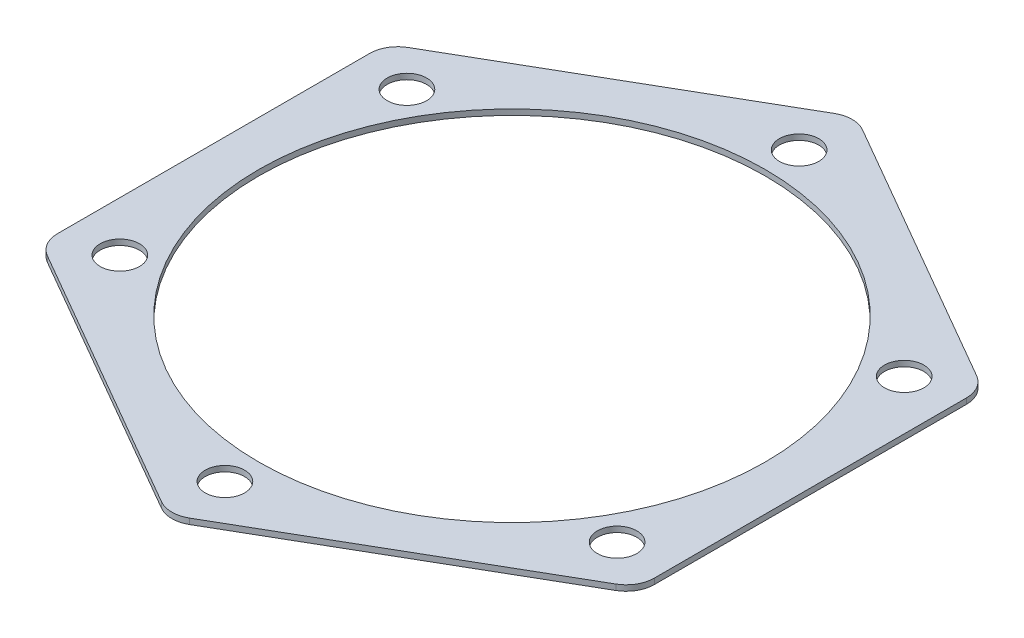
ISO-10303-21;
HEADER;
FILE_DESCRIPTION(('STEP AP214'),'2;1');
FILE_NAME('part.step','',(''),(''),'','','');
FILE_SCHEMA(('AUTOMOTIVE_DESIGN { 1 0 10303 214 1 1 1 1 }'));
ENDSEC;
DATA;
#1=APPLICATION_CONTEXT('core data for automotive mechanical design processes');
#2=APPLICATION_PROTOCOL_DEFINITION('international standard','automotive_design',2000,#1);
#3=PRODUCT_CONTEXT('',#1,'mechanical');
#4=PRODUCT('Part','Part','',(#3));
#5=PRODUCT_RELATED_PRODUCT_CATEGORY('part','',(#4));
#6=PRODUCT_DEFINITION_FORMATION('','',#4);
#7=PRODUCT_DEFINITION_CONTEXT('part definition',#1,'design');
#8=PRODUCT_DEFINITION('design','',#6,#7);
#9=PRODUCT_DEFINITION_SHAPE('','',#8);
#10=(LENGTH_UNIT() NAMED_UNIT(*) SI_UNIT(.MILLI.,.METRE.));
#11=(NAMED_UNIT(*) PLANE_ANGLE_UNIT() SI_UNIT($,.RADIAN.));
#12=(NAMED_UNIT(*) SI_UNIT($,.STERADIAN.) SOLID_ANGLE_UNIT());
#13=UNCERTAINTY_MEASURE_WITH_UNIT(LENGTH_MEASURE(1.E-05),#10,'distance_accuracy_value','');
#14=(GEOMETRIC_REPRESENTATION_CONTEXT(3) GLOBAL_UNCERTAINTY_ASSIGNED_CONTEXT((#13)) GLOBAL_UNIT_ASSIGNED_CONTEXT((#10,
#11,#12)) REPRESENTATION_CONTEXT('',''));
#15=CARTESIAN_POINT('',(0.,0.,0.));
#16=DIRECTION('',(0.,0.,1.));
#17=DIRECTION('',(1.,0.,0.));
#18=AXIS2_PLACEMENT_3D('',#15,#16,#17);
#19=CARTESIAN_POINT('',(0.,1.,-55.4256258422041));
#20=DIRECTION('',(0.,1.,0.));
#21=DIRECTION('',(0.,0.,1.));
#22=AXIS2_PLACEMENT_3D('',#19,#20,#21);
#23=PLANE('',#22);
#24=CARTESIAN_POINT('',(-44.167295593002,1.,25.5000000000025));
#25=DIRECTION('',(0.,1.,0.));
#26=DIRECTION('',(0.,0.,1.));
#27=AXIS2_PLACEMENT_3D('',#24,#25,#26);
#28=CIRCLE('',#27,3.50000000000536);
#29=CARTESIAN_POINT('',(-44.167295593002,1.,29.0000000000079));
#30=VERTEX_POINT('',#29);
#31=EDGE_CURVE('E348',#30,#30,#28,.T.);
#32=ORIENTED_EDGE('',*,*,#31,.F.);
#33=EDGE_LOOP('',(#32));
#34=FACE_BOUND('',#33,.T.);
#35=CARTESIAN_POINT('',(44.1672955930107,1.,25.4999999999975));
#36=DIRECTION('',(0.,1.,0.));
#37=DIRECTION('',(0.,0.,1.));
#38=AXIS2_PLACEMENT_3D('',#35,#36,#37);
#39=CIRCLE('',#38,3.50000000000365);
#40=CARTESIAN_POINT('',(44.1672955930107,1.,29.0000000000011));
#41=VERTEX_POINT('',#40);
#42=EDGE_CURVE('E364',#41,#41,#39,.T.);
#43=ORIENTED_EDGE('',*,*,#42,.F.);
#44=EDGE_LOOP('',(#43));
#45=FACE_BOUND('',#44,.T.);
#46=CARTESIAN_POINT('',(0.,1.,-51.));
#47=DIRECTION('',(0.,1.,0.));
#48=DIRECTION('',(0.,0.,1.));
#49=AXIS2_PLACEMENT_3D('',#46,#47,#48);
#50=CIRCLE('',#49,3.5);
#51=CARTESIAN_POINT('',(0.,1.,-47.5));
#52=VERTEX_POINT('',#51);
#53=EDGE_CURVE('E380',#52,#52,#50,.T.);
#54=ORIENTED_EDGE('',*,*,#53,.F.);
#55=EDGE_LOOP('',(#54));
#56=FACE_BOUND('',#55,.T.);
#57=CARTESIAN_POINT('',(0.,1.,-55.4256258422041));
#58=DIRECTION('',(0.,1.,0.));
#59=DIRECTION('',(0.,0.,1.));
#60=AXIS2_PLACEMENT_3D('',#57,#58,#59);
#61=CIRCLE('',#60,5.);
#62=CARTESIAN_POINT('',(2.50000000000002,1.,-59.7557528611263));
#63=VERTEX_POINT('',#62);
#64=CARTESIAN_POINT('',(-2.50000000000002,1.,-59.7557528611263));
#65=VERTEX_POINT('',#64);
#66=EDGE_CURVE('E204',#63,#65,#61,.T.);
#67=ORIENTED_EDGE('',*,*,#66,.T.);
#68=DIRECTION('',(-0.866025403784438,0.,0.5));
#69=VECTOR('',#68,1.);
#70=CARTESIAN_POINT('',(-2.50000000000002,1.,-59.7557528611263));
#71=LINE('',#70,#69);
#72=CARTESIAN_POINT('',(-50.5,1.,-32.0429399400242));
#73=VERTEX_POINT('',#72);
#74=EDGE_CURVE('E116',#65,#73,#71,.T.);
#75=ORIENTED_EDGE('',*,*,#74,.T.);
#76=CARTESIAN_POINT('',(-48.,1.,-27.712812921102));
#77=DIRECTION('',(0.,1.,0.));
#78=DIRECTION('',(0.,0.,1.));
#79=AXIS2_PLACEMENT_3D('',#76,#77,#78);
#80=CIRCLE('',#79,5.);
#81=CARTESIAN_POINT('',(-53.,1.,-27.712812921102));
#82=VERTEX_POINT('',#81);
#83=EDGE_CURVE('E241',#73,#82,#80,.T.);
#84=ORIENTED_EDGE('',*,*,#83,.T.);
#85=DIRECTION('',(0.,0.,1.));
#86=VECTOR('',#85,1.);
#87=CARTESIAN_POINT('',(-53.,1.,-27.712812921102));
#88=LINE('',#87,#86);
#89=CARTESIAN_POINT('',(-53.,1.,27.712812921102));
#90=VERTEX_POINT('',#89);
#91=EDGE_CURVE('E261',#82,#90,#88,.T.);
#92=ORIENTED_EDGE('',*,*,#91,.T.);
#93=CARTESIAN_POINT('',(-48.,1.,27.7128129211021));
#94=DIRECTION('',(0.,1.,0.));
#95=DIRECTION('',(0.,0.,-1.));
#96=AXIS2_PLACEMENT_3D('',#93,#94,#95);
#97=CIRCLE('',#96,5.);
#98=CARTESIAN_POINT('',(-50.5,1.,32.0429399400243));
#99=VERTEX_POINT('',#98);
#100=EDGE_CURVE('E257',#90,#99,#97,.T.);
#101=ORIENTED_EDGE('',*,*,#100,.T.);
#102=DIRECTION('',(0.866025403784439,0.,0.5));
#103=VECTOR('',#102,1.);
#104=CARTESIAN_POINT('',(-50.5,1.,32.0429399400243));
#105=LINE('',#104,#103);
#106=CARTESIAN_POINT('',(-2.50000000000002,1.,59.7557528611263));
#107=VERTEX_POINT('',#106);
#108=EDGE_CURVE('E260',#99,#107,#105,.T.);
#109=ORIENTED_EDGE('',*,*,#108,.T.);
#110=CARTESIAN_POINT('',(0.,1.,55.4256258422041));
#111=DIRECTION('',(0.,1.,0.));
#112=DIRECTION('',(0.,0.,1.));
#113=AXIS2_PLACEMENT_3D('',#110,#111,#112);
#114=CIRCLE('',#113,5.);
#115=CARTESIAN_POINT('',(2.50000000000003,1.,59.7557528611263));
#116=VERTEX_POINT('',#115);
#117=EDGE_CURVE('E265',#107,#116,#114,.T.);
#118=ORIENTED_EDGE('',*,*,#117,.T.);
#119=DIRECTION('',(0.866025403784438,0.,-0.500000000000001));
#120=VECTOR('',#119,1.);
#121=CARTESIAN_POINT('',(2.50000000000003,1.,59.7557528611263));
#122=LINE('',#121,#120);
#123=CARTESIAN_POINT('',(50.5,1.,32.0429399400242));
#124=VERTEX_POINT('',#123);
#125=EDGE_CURVE('E272',#116,#124,#122,.T.);
#126=ORIENTED_EDGE('',*,*,#125,.T.);
#127=CARTESIAN_POINT('',(48.,1.,27.712812921102));
#128=DIRECTION('',(0.,1.,0.));
#129=DIRECTION('',(0.,0.,1.));
#130=AXIS2_PLACEMENT_3D('',#127,#128,#129);
#131=CIRCLE('',#130,5.);
#132=CARTESIAN_POINT('',(53.,1.,27.712812921102));
#133=VERTEX_POINT('',#132);
#134=EDGE_CURVE('E147',#124,#133,#131,.T.);
#135=ORIENTED_EDGE('',*,*,#134,.T.);
#136=DIRECTION('',(0.,0.,-1.));
#137=VECTOR('',#136,1.);
#138=CARTESIAN_POINT('',(53.,1.,27.712812921102));
#139=LINE('',#138,#137);
#140=CARTESIAN_POINT('',(53.,1.,-27.7128129211021));
#141=VERTEX_POINT('',#140);
#142=EDGE_CURVE('E141',#133,#141,#139,.T.);
#143=ORIENTED_EDGE('',*,*,#142,.T.);
#144=CARTESIAN_POINT('',(48.,1.,-27.7128129211021));
#145=DIRECTION('',(0.,1.,0.));
#146=DIRECTION('',(0.,0.,1.));
#147=AXIS2_PLACEMENT_3D('',#144,#145,#146);
#148=CIRCLE('',#147,5.);
#149=CARTESIAN_POINT('',(50.5,1.,-32.0429399400243));
#150=VERTEX_POINT('',#149);
#151=EDGE_CURVE('E145',#141,#150,#148,.T.);
#152=ORIENTED_EDGE('',*,*,#151,.T.);
#153=DIRECTION('',(-0.866025403784439,0.,-0.5));
#154=VECTOR('',#153,1.);
#155=CARTESIAN_POINT('',(50.5,1.,-32.0429399400243));
#156=LINE('',#155,#154);
#157=EDGE_CURVE('E61',#150,#63,#156,.T.);
#158=ORIENTED_EDGE('',*,*,#157,.T.);
#159=EDGE_LOOP('',(#67,#75,#84,#92,#101,#109,#118,#126,#135,#143,#152,#158));
#160=FACE_BOUND('',#159,.T.);
#161=CARTESIAN_POINT('',(0.,1.,0.));
#162=DIRECTION('',(0.,1.,0.));
#163=DIRECTION('',(0.,0.,1.));
#164=AXIS2_PLACEMENT_3D('',#161,#162,#163);
#165=CIRCLE('',#164,45.);
#166=CARTESIAN_POINT('',(0.,1.,45.));
#167=VERTEX_POINT('',#166);
#168=EDGE_CURVE('E174',#167,#167,#165,.T.);
#169=ORIENTED_EDGE('',*,*,#168,.F.);
#170=EDGE_LOOP('',(#169));
#171=FACE_BOUND('',#170,.T.);
#172=CARTESIAN_POINT('',(44.1672955930078,1.,-25.5000000000025));
#173=DIRECTION('',(0.,1.,0.));
#174=DIRECTION('',(0.,0.,1.));
#175=AXIS2_PLACEMENT_3D('',#172,#173,#174);
#176=CIRCLE('',#175,3.50000000000079);
#177=CARTESIAN_POINT('',(44.1672955930078,1.,-22.0000000000017));
#178=VERTEX_POINT('',#177);
#179=EDGE_CURVE('E372',#178,#178,#176,.T.);
#180=ORIENTED_EDGE('',*,*,#179,.F.);
#181=EDGE_LOOP('',(#180));
#182=FACE_BOUND('',#181,.T.);
#183=CARTESIAN_POINT('',(5.77929162777546E-12,1.,51.));
#184=DIRECTION('',(0.,1.,0.));
#185=DIRECTION('',(0.,0.,1.));
#186=AXIS2_PLACEMENT_3D('',#183,#184,#185);
#187=CIRCLE('',#186,3.50000000000587);
#188=CARTESIAN_POINT('',(5.77929162777546E-12,1.,54.5000000000059));
#189=VERTEX_POINT('',#188);
#190=EDGE_CURVE('E356',#189,#189,#187,.T.);
#191=ORIENTED_EDGE('',*,*,#190,.F.);
#192=EDGE_LOOP('',(#191));
#193=FACE_BOUND('',#192,.T.);
#194=CARTESIAN_POINT('',(-44.1672955930049,1.,-25.4999999999975));
#195=DIRECTION('',(0.,1.,0.));
#196=DIRECTION('',(0.,0.,1.));
#197=AXIS2_PLACEMENT_3D('',#194,#195,#196);
#198=CIRCLE('',#197,3.50000000000272);
#199=CARTESIAN_POINT('',(-44.1672955930049,1.,-21.9999999999947));
#200=VERTEX_POINT('',#199);
#201=EDGE_CURVE('E337',#200,#200,#198,.T.);
#202=ORIENTED_EDGE('',*,*,#201,.F.);
#203=EDGE_LOOP('',(#202));
#204=FACE_BOUND('',#203,.T.);
#205=ADVANCED_FACE('F43',(#34,#45,#56,#160,#171,#182,#193,#204),#23,.T.);
#206=CARTESIAN_POINT('',(0.,0.,-55.4256258422041));
#207=DIRECTION('',(0.,1.,0.));
#208=DIRECTION('',(0.,0.,1.));
#209=AXIS2_PLACEMENT_3D('',#206,#207,#208);
#210=PLANE('',#209);
#211=CARTESIAN_POINT('',(0.,0.,-55.4256258422041));
#212=DIRECTION('',(0.,1.,0.));
#213=DIRECTION('',(0.,0.,1.));
#214=AXIS2_PLACEMENT_3D('',#211,#212,#213);
#215=CIRCLE('',#214,5.);
#216=CARTESIAN_POINT('',(2.50000000000002,0.,-59.7557528611263));
#217=VERTEX_POINT('',#216);
#218=CARTESIAN_POINT('',(-2.50000000000002,0.,-59.7557528611263));
#219=VERTEX_POINT('',#218);
#220=EDGE_CURVE('E169',#217,#219,#215,.T.);
#221=ORIENTED_EDGE('',*,*,#220,.F.);
#222=DIRECTION('',(-0.866025403784439,0.,-0.5));
#223=VECTOR('',#222,1.);
#224=CARTESIAN_POINT('',(50.5,0.,-32.0429399400243));
#225=LINE('',#224,#223);
#226=CARTESIAN_POINT('',(50.5,0.,-32.0429399400243));
#227=VERTEX_POINT('',#226);
#228=EDGE_CURVE('E108',#227,#217,#225,.T.);
#229=ORIENTED_EDGE('',*,*,#228,.F.);
#230=CARTESIAN_POINT('',(48.,0.,-27.7128129211021));
#231=DIRECTION('',(0.,1.,0.));
#232=DIRECTION('',(0.,0.,1.));
#233=AXIS2_PLACEMENT_3D('',#230,#231,#232);
#234=CIRCLE('',#233,5.);
#235=CARTESIAN_POINT('',(53.,0.,-27.7128129211021));
#236=VERTEX_POINT('',#235);
#237=EDGE_CURVE('E102',#236,#227,#234,.T.);
#238=ORIENTED_EDGE('',*,*,#237,.F.);
#239=DIRECTION('',(0.,0.,-1.));
#240=VECTOR('',#239,1.);
#241=CARTESIAN_POINT('',(53.,0.,27.712812921102));
#242=LINE('',#241,#240);
#243=CARTESIAN_POINT('',(53.,0.,27.712812921102));
#244=VERTEX_POINT('',#243);
#245=EDGE_CURVE('E156',#244,#236,#242,.T.);
#246=ORIENTED_EDGE('',*,*,#245,.F.);
#247=CARTESIAN_POINT('',(48.,0.,27.712812921102));
#248=DIRECTION('',(0.,1.,0.));
#249=DIRECTION('',(0.,0.,1.));
#250=AXIS2_PLACEMENT_3D('',#247,#248,#249);
#251=CIRCLE('',#250,5.);
#252=CARTESIAN_POINT('',(50.5,0.,32.0429399400242));
#253=VERTEX_POINT('',#252);
#254=EDGE_CURVE('E195',#253,#244,#251,.T.);
#255=ORIENTED_EDGE('',*,*,#254,.F.);
#256=DIRECTION('',(0.866025403784438,0.,-0.500000000000001));
#257=VECTOR('',#256,1.);
#258=CARTESIAN_POINT('',(2.50000000000003,0.,59.7557528611263));
#259=LINE('',#258,#257);
#260=CARTESIAN_POINT('',(2.50000000000003,0.,59.7557528611263));
#261=VERTEX_POINT('',#260);
#262=EDGE_CURVE('E192',#261,#253,#259,.T.);
#263=ORIENTED_EDGE('',*,*,#262,.F.);
#264=CARTESIAN_POINT('',(0.,0.,55.4256258422041));
#265=DIRECTION('',(0.,1.,0.));
#266=DIRECTION('',(0.,0.,1.));
#267=AXIS2_PLACEMENT_3D('',#264,#265,#266);
#268=CIRCLE('',#267,5.);
#269=CARTESIAN_POINT('',(-2.50000000000002,0.,59.7557528611263));
#270=VERTEX_POINT('',#269);
#271=EDGE_CURVE('E189',#270,#261,#268,.T.);
#272=ORIENTED_EDGE('',*,*,#271,.F.);
#273=DIRECTION('',(0.866025403784439,0.,0.5));
#274=VECTOR('',#273,1.);
#275=CARTESIAN_POINT('',(-50.5,0.,32.0429399400243));
#276=LINE('',#275,#274);
#277=CARTESIAN_POINT('',(-50.5,0.,32.0429399400243));
#278=VERTEX_POINT('',#277);
#279=EDGE_CURVE('E186',#278,#270,#276,.T.);
#280=ORIENTED_EDGE('',*,*,#279,.F.);
#281=CARTESIAN_POINT('',(-48.,0.,27.7128129211021));
#282=DIRECTION('',(0.,1.,0.));
#283=DIRECTION('',(0.,0.,-1.));
#284=AXIS2_PLACEMENT_3D('',#281,#282,#283);
#285=CIRCLE('',#284,5.);
#286=CARTESIAN_POINT('',(-53.,0.,27.712812921102));
#287=VERTEX_POINT('',#286);
#288=EDGE_CURVE('E183',#287,#278,#285,.T.);
#289=ORIENTED_EDGE('',*,*,#288,.F.);
#290=DIRECTION('',(0.,0.,1.));
#291=VECTOR('',#290,1.);
#292=CARTESIAN_POINT('',(-53.,0.,-27.712812921102));
#293=LINE('',#292,#291);
#294=CARTESIAN_POINT('',(-53.,0.,-27.712812921102));
#295=VERTEX_POINT('',#294);
#296=EDGE_CURVE('E180',#295,#287,#293,.T.);
#297=ORIENTED_EDGE('',*,*,#296,.F.);
#298=CARTESIAN_POINT('',(-48.,0.,-27.712812921102));
#299=DIRECTION('',(0.,1.,0.));
#300=DIRECTION('',(0.,0.,1.));
#301=AXIS2_PLACEMENT_3D('',#298,#299,#300);
#302=CIRCLE('',#301,5.);
#303=CARTESIAN_POINT('',(-50.5,0.,-32.0429399400242));
#304=VERTEX_POINT('',#303);
#305=EDGE_CURVE('E177',#304,#295,#302,.T.);
#306=ORIENTED_EDGE('',*,*,#305,.F.);
#307=DIRECTION('',(-0.866025403784438,0.,0.5));
#308=VECTOR('',#307,1.);
#309=CARTESIAN_POINT('',(-2.50000000000002,0.,-59.7557528611263));
#310=LINE('',#309,#308);
#311=EDGE_CURVE('E173',#219,#304,#310,.T.);
#312=ORIENTED_EDGE('',*,*,#311,.F.);
#313=EDGE_LOOP('',(#221,#229,#238,#246,#255,#263,#272,#280,#289,#297,#306,#312));
#314=FACE_BOUND('',#313,.T.);
#315=CARTESIAN_POINT('',(0.,0.,0.));
#316=DIRECTION('',(0.,1.,0.));
#317=DIRECTION('',(0.,0.,1.));
#318=AXIS2_PLACEMENT_3D('',#315,#316,#317);
#319=CIRCLE('',#318,45.);
#320=CARTESIAN_POINT('',(0.,0.,45.));
#321=VERTEX_POINT('',#320);
#322=EDGE_CURVE('E384',#321,#321,#319,.T.);
#323=ORIENTED_EDGE('',*,*,#322,.T.);
#324=EDGE_LOOP('',(#323));
#325=FACE_BOUND('',#324,.T.);
#326=CARTESIAN_POINT('',(0.,0.,-51.));
#327=DIRECTION('',(0.,1.,0.));
#328=DIRECTION('',(0.,0.,1.));
#329=AXIS2_PLACEMENT_3D('',#326,#327,#328);
#330=CIRCLE('',#329,3.5);
#331=CARTESIAN_POINT('',(0.,0.,-47.5));
#332=VERTEX_POINT('',#331);
#333=EDGE_CURVE('E376',#332,#332,#330,.T.);
#334=ORIENTED_EDGE('',*,*,#333,.T.);
#335=EDGE_LOOP('',(#334));
#336=FACE_BOUND('',#335,.T.);
#337=CARTESIAN_POINT('',(44.1672955930078,0.,-25.5000000000025));
#338=DIRECTION('',(0.,1.,0.));
#339=DIRECTION('',(0.,0.,1.));
#340=AXIS2_PLACEMENT_3D('',#337,#338,#339);
#341=CIRCLE('',#340,3.50000000000079);
#342=CARTESIAN_POINT('',(44.1672955930078,0.,-22.0000000000017));
#343=VERTEX_POINT('',#342);
#344=EDGE_CURVE('E368',#343,#343,#341,.T.);
#345=ORIENTED_EDGE('',*,*,#344,.T.);
#346=EDGE_LOOP('',(#345));
#347=FACE_BOUND('',#346,.T.);
#348=CARTESIAN_POINT('',(44.1672955930107,0.,25.4999999999975));
#349=DIRECTION('',(0.,1.,0.));
#350=DIRECTION('',(0.,0.,1.));
#351=AXIS2_PLACEMENT_3D('',#348,#349,#350);
#352=CIRCLE('',#351,3.50000000000365);
#353=CARTESIAN_POINT('',(44.1672955930107,0.,29.0000000000011));
#354=VERTEX_POINT('',#353);
#355=EDGE_CURVE('E360',#354,#354,#352,.T.);
#356=ORIENTED_EDGE('',*,*,#355,.T.);
#357=EDGE_LOOP('',(#356));
#358=FACE_BOUND('',#357,.T.);
#359=CARTESIAN_POINT('',(5.77929162777546E-12,0.,51.));
#360=DIRECTION('',(0.,1.,0.));
#361=DIRECTION('',(0.,0.,1.));
#362=AXIS2_PLACEMENT_3D('',#359,#360,#361);
#363=CIRCLE('',#362,3.50000000000587);
#364=CARTESIAN_POINT('',(5.77929162777546E-12,0.,54.5000000000059));
#365=VERTEX_POINT('',#364);
#366=EDGE_CURVE('E352',#365,#365,#363,.T.);
#367=ORIENTED_EDGE('',*,*,#366,.T.);
#368=EDGE_LOOP('',(#367));
#369=FACE_BOUND('',#368,.T.);
#370=CARTESIAN_POINT('',(-44.167295593002,0.,25.5000000000025));
#371=DIRECTION('',(0.,1.,0.));
#372=DIRECTION('',(0.,0.,1.));
#373=AXIS2_PLACEMENT_3D('',#370,#371,#372);
#374=CIRCLE('',#373,3.50000000000536);
#375=CARTESIAN_POINT('',(-44.167295593002,0.,29.0000000000079));
#376=VERTEX_POINT('',#375);
#377=EDGE_CURVE('E345',#376,#376,#374,.T.);
#378=ORIENTED_EDGE('',*,*,#377,.T.);
#379=EDGE_LOOP('',(#378));
#380=FACE_BOUND('',#379,.T.);
#381=CARTESIAN_POINT('',(-44.1672955930049,0.,-25.4999999999975));
#382=DIRECTION('',(0.,1.,0.));
#383=DIRECTION('',(0.,0.,1.));
#384=AXIS2_PLACEMENT_3D('',#381,#382,#383);
#385=CIRCLE('',#384,3.50000000000272);
#386=CARTESIAN_POINT('',(-44.1672955930049,0.,-21.9999999999947));
#387=VERTEX_POINT('',#386);
#388=EDGE_CURVE('E340',#387,#387,#385,.T.);
#389=ORIENTED_EDGE('',*,*,#388,.T.);
#390=EDGE_LOOP('',(#389));
#391=FACE_BOUND('',#390,.T.);
#392=ADVANCED_FACE('F245',(#314,#325,#336,#347,#358,#369,#380,#391),#210,.F.);
#393=CARTESIAN_POINT('',(0.,1.,-55.4256258422041));
#394=DIRECTION('',(0.,-1.,0.));
#395=DIRECTION('',(0.,0.,-1.));
#396=AXIS2_PLACEMENT_3D('',#393,#394,#395);
#397=CYLINDRICAL_SURFACE('',#396,5.);
#398=ORIENTED_EDGE('',*,*,#220,.T.);
#399=DIRECTION('',(0.,-1.,0.));
#400=VECTOR('',#399,1.);
#401=CARTESIAN_POINT('',(-2.50000000000002,1.,-59.7557528611263));
#402=LINE('',#401,#400);
#403=EDGE_CURVE('E11',#65,#219,#402,.T.);
#404=ORIENTED_EDGE('',*,*,#403,.F.);
#405=ORIENTED_EDGE('',*,*,#66,.F.);
#406=DIRECTION('',(0.,-1.,0.));
#407=VECTOR('',#406,1.);
#408=CARTESIAN_POINT('',(2.50000000000002,1.,-59.7557528611263));
#409=LINE('',#408,#407);
#410=EDGE_CURVE('E165',#63,#217,#409,.T.);
#411=ORIENTED_EDGE('',*,*,#410,.T.);
#412=EDGE_LOOP('',(#398,#404,#405,#411));
#413=FACE_BOUND('',#412,.T.);
#414=ADVANCED_FACE('F45',(#413),#397,.T.);
#415=CARTESIAN_POINT('',(-2.50000000000002,1.,-59.7557528611263));
#416=DIRECTION('',(0.5,0.,0.866025403784438));
#417=DIRECTION('',(0.866025403784438,0.,-0.5));
#418=AXIS2_PLACEMENT_3D('',#415,#416,#417);
#419=PLANE('',#418);
#420=ORIENTED_EDGE('',*,*,#311,.T.);
#421=DIRECTION('',(0.,-1.,0.));
#422=VECTOR('',#421,1.);
#423=CARTESIAN_POINT('',(-50.5,1.,-32.0429399400242));
#424=LINE('',#423,#422);
#425=EDGE_CURVE('E53',#73,#304,#424,.T.);
#426=ORIENTED_EDGE('',*,*,#425,.F.);
#427=ORIENTED_EDGE('',*,*,#74,.F.);
#428=ORIENTED_EDGE('',*,*,#403,.T.);
#429=EDGE_LOOP('',(#420,#426,#427,#428));
#430=FACE_BOUND('',#429,.T.);
#431=ADVANCED_FACE('F537',(#430),#419,.F.);
#432=CARTESIAN_POINT('',(-48.,1.,-27.712812921102));
#433=DIRECTION('',(0.,-1.,0.));
#434=DIRECTION('',(0.,0.,-1.));
#435=AXIS2_PLACEMENT_3D('',#432,#433,#434);
#436=CYLINDRICAL_SURFACE('',#435,5.);
#437=ORIENTED_EDGE('',*,*,#305,.T.);
#438=DIRECTION('',(0.,-1.,0.));
#439=VECTOR('',#438,1.);
#440=CARTESIAN_POINT('',(-53.,1.,-27.712812921102));
#441=LINE('',#440,#439);
#442=EDGE_CURVE('E231',#82,#295,#441,.T.);
#443=ORIENTED_EDGE('',*,*,#442,.F.);
#444=ORIENTED_EDGE('',*,*,#83,.F.);
#445=ORIENTED_EDGE('',*,*,#425,.T.);
#446=EDGE_LOOP('',(#437,#443,#444,#445));
#447=FACE_BOUND('',#446,.T.);
#448=ADVANCED_FACE('F239',(#447),#436,.T.);
#449=CARTESIAN_POINT('',(-53.,1.,-27.712812921102));
#450=DIRECTION('',(1.,0.,0.));
#451=DIRECTION('',(0.,0.,-1.));
#452=AXIS2_PLACEMENT_3D('',#449,#450,#451);
#453=PLANE('',#452);
#454=ORIENTED_EDGE('',*,*,#296,.T.);
#455=DIRECTION('',(0.,-1.,0.));
#456=VECTOR('',#455,1.);
#457=CARTESIAN_POINT('',(-53.,1.,27.712812921102));
#458=LINE('',#457,#456);
#459=EDGE_CURVE('E227',#90,#287,#458,.T.);
#460=ORIENTED_EDGE('',*,*,#459,.F.);
#461=ORIENTED_EDGE('',*,*,#91,.F.);
#462=ORIENTED_EDGE('',*,*,#442,.T.);
#463=EDGE_LOOP('',(#454,#460,#461,#462));
#464=FACE_BOUND('',#463,.T.);
#465=ADVANCED_FACE('F251',(#464),#453,.F.);
#466=CARTESIAN_POINT('',(-48.,1.,27.7128129211021));
#467=DIRECTION('',(0.,-1.,0.));
#468=DIRECTION('',(0.,0.,-1.));
#469=AXIS2_PLACEMENT_3D('',#466,#467,#468);
#470=CYLINDRICAL_SURFACE('',#469,5.);
#471=ORIENTED_EDGE('',*,*,#288,.T.);
#472=DIRECTION('',(0.,-1.,0.));
#473=VECTOR('',#472,1.);
#474=CARTESIAN_POINT('',(-50.5,1.,32.0429399400243));
#475=LINE('',#474,#473);
#476=EDGE_CURVE('E223',#99,#278,#475,.T.);
#477=ORIENTED_EDGE('',*,*,#476,.F.);
#478=ORIENTED_EDGE('',*,*,#100,.F.);
#479=ORIENTED_EDGE('',*,*,#459,.T.);
#480=EDGE_LOOP('',(#471,#477,#478,#479));
#481=FACE_BOUND('',#480,.T.);
#482=ADVANCED_FACE('F255',(#481),#470,.T.);
#483=CARTESIAN_POINT('',(-50.5,1.,32.0429399400243));
#484=DIRECTION('',(0.5,0.,-0.866025403784439));
#485=DIRECTION('',(-0.866025403784439,0.,-0.5));
#486=AXIS2_PLACEMENT_3D('',#483,#484,#485);
#487=PLANE('',#486);
#488=ORIENTED_EDGE('',*,*,#279,.T.);
#489=DIRECTION('',(0.,-1.,0.));
#490=VECTOR('',#489,1.);
#491=CARTESIAN_POINT('',(-2.50000000000002,1.,59.7557528611263));
#492=LINE('',#491,#490);
#493=EDGE_CURVE('E219',#107,#270,#492,.T.);
#494=ORIENTED_EDGE('',*,*,#493,.F.);
#495=ORIENTED_EDGE('',*,*,#108,.F.);
#496=ORIENTED_EDGE('',*,*,#476,.T.);
#497=EDGE_LOOP('',(#488,#494,#495,#496));
#498=FACE_BOUND('',#497,.T.);
#499=ADVANCED_FACE('F498',(#498),#487,.F.);
#500=CARTESIAN_POINT('',(0.,1.,55.4256258422041));
#501=DIRECTION('',(0.,-1.,0.));
#502=DIRECTION('',(0.,0.,-1.));
#503=AXIS2_PLACEMENT_3D('',#500,#501,#502);
#504=CYLINDRICAL_SURFACE('',#503,5.);
#505=ORIENTED_EDGE('',*,*,#271,.T.);
#506=DIRECTION('',(0.,-1.,0.));
#507=VECTOR('',#506,1.);
#508=CARTESIAN_POINT('',(2.50000000000003,1.,59.7557528611263));
#509=LINE('',#508,#507);
#510=EDGE_CURVE('E215',#116,#261,#509,.T.);
#511=ORIENTED_EDGE('',*,*,#510,.F.);
#512=ORIENTED_EDGE('',*,*,#117,.F.);
#513=ORIENTED_EDGE('',*,*,#493,.T.);
#514=EDGE_LOOP('',(#505,#511,#512,#513));
#515=FACE_BOUND('',#514,.T.);
#516=ADVANCED_FACE('F488',(#515),#504,.T.);
#517=CARTESIAN_POINT('',(2.50000000000003,1.,59.7557528611263));
#518=DIRECTION('',(-0.500000000000001,0.,-0.866025403784438));
#519=DIRECTION('',(-0.866025403784438,0.,0.500000000000001));
#520=AXIS2_PLACEMENT_3D('',#517,#518,#519);
#521=PLANE('',#520);
#522=ORIENTED_EDGE('',*,*,#262,.T.);
#523=DIRECTION('',(0.,-1.,0.));
#524=VECTOR('',#523,1.);
#525=CARTESIAN_POINT('',(50.5,1.,32.0429399400242));
#526=LINE('',#525,#524);
#527=EDGE_CURVE('E211',#124,#253,#526,.T.);
#528=ORIENTED_EDGE('',*,*,#527,.F.);
#529=ORIENTED_EDGE('',*,*,#125,.F.);
#530=ORIENTED_EDGE('',*,*,#510,.T.);
#531=EDGE_LOOP('',(#522,#528,#529,#530));
#532=FACE_BOUND('',#531,.T.);
#533=ADVANCED_FACE('F280',(#532),#521,.F.);
#534=CARTESIAN_POINT('',(48.,1.,27.712812921102));
#535=DIRECTION('',(0.,-1.,0.));
#536=DIRECTION('',(0.,0.,-1.));
#537=AXIS2_PLACEMENT_3D('',#534,#535,#536);
#538=CYLINDRICAL_SURFACE('',#537,5.);
#539=ORIENTED_EDGE('',*,*,#254,.T.);
#540=DIRECTION('',(0.,-1.,0.));
#541=VECTOR('',#540,1.);
#542=CARTESIAN_POINT('',(53.,1.,27.712812921102));
#543=LINE('',#542,#541);
#544=EDGE_CURVE('E158',#133,#244,#543,.T.);
#545=ORIENTED_EDGE('',*,*,#544,.F.);
#546=ORIENTED_EDGE('',*,*,#134,.F.);
#547=ORIENTED_EDGE('',*,*,#527,.T.);
#548=EDGE_LOOP('',(#539,#545,#546,#547));
#549=FACE_BOUND('',#548,.T.);
#550=ADVANCED_FACE('F284',(#549),#538,.T.);
#551=CARTESIAN_POINT('',(53.,1.,27.712812921102));
#552=DIRECTION('',(-1.,0.,0.));
#553=DIRECTION('',(0.,0.,1.));
#554=AXIS2_PLACEMENT_3D('',#551,#552,#553);
#555=PLANE('',#554);
#556=ORIENTED_EDGE('',*,*,#245,.T.);
#557=DIRECTION('',(0.,-1.,0.));
#558=VECTOR('',#557,1.);
#559=CARTESIAN_POINT('',(53.,1.,-27.7128129211021));
#560=LINE('',#559,#558);
#561=EDGE_CURVE('E153',#141,#236,#560,.T.);
#562=ORIENTED_EDGE('',*,*,#561,.F.);
#563=ORIENTED_EDGE('',*,*,#142,.F.);
#564=ORIENTED_EDGE('',*,*,#544,.T.);
#565=EDGE_LOOP('',(#556,#562,#563,#564));
#566=FACE_BOUND('',#565,.T.);
#567=ADVANCED_FACE('F154',(#566),#555,.F.);
#568=CARTESIAN_POINT('',(48.,1.,-27.7128129211021));
#569=DIRECTION('',(0.,-1.,0.));
#570=DIRECTION('',(0.,0.,-1.));
#571=AXIS2_PLACEMENT_3D('',#568,#569,#570);
#572=CYLINDRICAL_SURFACE('',#571,5.);
#573=ORIENTED_EDGE('',*,*,#237,.T.);
#574=DIRECTION('',(0.,-1.,0.));
#575=VECTOR('',#574,1.);
#576=CARTESIAN_POINT('',(50.5,1.,-32.0429399400243));
#577=LINE('',#576,#575);
#578=EDGE_CURVE('E159',#150,#227,#577,.T.);
#579=ORIENTED_EDGE('',*,*,#578,.F.);
#580=ORIENTED_EDGE('',*,*,#151,.F.);
#581=ORIENTED_EDGE('',*,*,#561,.T.);
#582=EDGE_LOOP('',(#573,#579,#580,#581));
#583=FACE_BOUND('',#582,.T.);
#584=ADVANCED_FACE('F161',(#583),#572,.T.);
#585=CARTESIAN_POINT('',(50.5,1.,-32.0429399400243));
#586=DIRECTION('',(-0.5,0.,0.866025403784439));
#587=DIRECTION('',(0.866025403784439,0.,0.5));
#588=AXIS2_PLACEMENT_3D('',#585,#586,#587);
#589=PLANE('',#588);
#590=ORIENTED_EDGE('',*,*,#228,.T.);
#591=ORIENTED_EDGE('',*,*,#410,.F.);
#592=ORIENTED_EDGE('',*,*,#157,.F.);
#593=ORIENTED_EDGE('',*,*,#578,.T.);
#594=EDGE_LOOP('',(#590,#591,#592,#593));
#595=FACE_BOUND('',#594,.T.);
#596=ADVANCED_FACE('F288',(#595),#589,.F.);
#597=CARTESIAN_POINT('',(0.,1.,0.));
#598=DIRECTION('',(0.,-1.,0.));
#599=DIRECTION('',(0.,0.,-1.));
#600=AXIS2_PLACEMENT_3D('',#597,#598,#599);
#601=CYLINDRICAL_SURFACE('',#600,45.);
#602=ORIENTED_EDGE('',*,*,#168,.T.);
#603=EDGE_LOOP('',(#602));
#604=FACE_BOUND('',#603,.T.);
#605=ORIENTED_EDGE('',*,*,#322,.F.);
#606=EDGE_LOOP('',(#605));
#607=FACE_BOUND('',#606,.T.);
#608=ADVANCED_FACE('F290',(#604,#607),#601,.F.);
#609=CARTESIAN_POINT('',(0.,1.,-51.));
#610=DIRECTION('',(0.,-1.,0.));
#611=DIRECTION('',(0.,0.,-1.));
#612=AXIS2_PLACEMENT_3D('',#609,#610,#611);
#613=CYLINDRICAL_SURFACE('',#612,3.5);
#614=ORIENTED_EDGE('',*,*,#53,.T.);
#615=EDGE_LOOP('',(#614));
#616=FACE_BOUND('',#615,.T.);
#617=ORIENTED_EDGE('',*,*,#333,.F.);
#618=EDGE_LOOP('',(#617));
#619=FACE_BOUND('',#618,.T.);
#620=ADVANCED_FACE('F296',(#616,#619),#613,.F.);
#621=CARTESIAN_POINT('',(44.1672955930078,1.,-25.5000000000025));
#622=DIRECTION('',(0.,-1.,0.));
#623=DIRECTION('',(0.,0.,-1.));
#624=AXIS2_PLACEMENT_3D('',#621,#622,#623);
#625=CYLINDRICAL_SURFACE('',#624,3.50000000000079);
#626=ORIENTED_EDGE('',*,*,#179,.T.);
#627=EDGE_LOOP('',(#626));
#628=FACE_BOUND('',#627,.T.);
#629=ORIENTED_EDGE('',*,*,#344,.F.);
#630=EDGE_LOOP('',(#629));
#631=FACE_BOUND('',#630,.T.);
#632=ADVANCED_FACE('F312',(#628,#631),#625,.F.);
#633=CARTESIAN_POINT('',(44.1672955930107,1.,25.4999999999975));
#634=DIRECTION('',(0.,-1.,0.));
#635=DIRECTION('',(0.,0.,-1.));
#636=AXIS2_PLACEMENT_3D('',#633,#634,#635);
#637=CYLINDRICAL_SURFACE('',#636,3.50000000000365);
#638=ORIENTED_EDGE('',*,*,#42,.T.);
#639=EDGE_LOOP('',(#638));
#640=FACE_BOUND('',#639,.T.);
#641=ORIENTED_EDGE('',*,*,#355,.F.);
#642=EDGE_LOOP('',(#641));
#643=FACE_BOUND('',#642,.T.);
#644=ADVANCED_FACE('F316',(#640,#643),#637,.F.);
#645=CARTESIAN_POINT('',(5.77929162777546E-12,1.,51.));
#646=DIRECTION('',(0.,-1.,0.));
#647=DIRECTION('',(0.,0.,-1.));
#648=AXIS2_PLACEMENT_3D('',#645,#646,#647);
#649=CYLINDRICAL_SURFACE('',#648,3.50000000000587);
#650=ORIENTED_EDGE('',*,*,#190,.T.);
#651=EDGE_LOOP('',(#650));
#652=FACE_BOUND('',#651,.T.);
#653=ORIENTED_EDGE('',*,*,#366,.F.);
#654=EDGE_LOOP('',(#653));
#655=FACE_BOUND('',#654,.T.);
#656=ADVANCED_FACE('F320',(#652,#655),#649,.F.);
#657=CARTESIAN_POINT('',(-44.167295593002,1.,25.5000000000025));
#658=DIRECTION('',(0.,-1.,0.));
#659=DIRECTION('',(0.,0.,-1.));
#660=AXIS2_PLACEMENT_3D('',#657,#658,#659);
#661=CYLINDRICAL_SURFACE('',#660,3.50000000000536);
#662=ORIENTED_EDGE('',*,*,#31,.T.);
#663=EDGE_LOOP('',(#662));
#664=FACE_BOUND('',#663,.T.);
#665=ORIENTED_EDGE('',*,*,#377,.F.);
#666=EDGE_LOOP('',(#665));
#667=FACE_BOUND('',#666,.T.);
#668=ADVANCED_FACE('F324',(#664,#667),#661,.F.);
#669=CARTESIAN_POINT('',(-44.1672955930049,1.,-25.4999999999975));
#670=DIRECTION('',(0.,-1.,0.));
#671=DIRECTION('',(0.,0.,-1.));
#672=AXIS2_PLACEMENT_3D('',#669,#670,#671);
#673=CYLINDRICAL_SURFACE('',#672,3.50000000000272);
#674=ORIENTED_EDGE('',*,*,#201,.T.);
#675=EDGE_LOOP('',(#674));
#676=FACE_BOUND('',#675,.T.);
#677=ORIENTED_EDGE('',*,*,#388,.F.);
#678=EDGE_LOOP('',(#677));
#679=FACE_BOUND('',#678,.T.);
#680=ADVANCED_FACE('F328',(#676,#679),#673,.F.);
#681=CLOSED_SHELL('',(#205,#392,#414,#431,#448,#465,#482,#499,#516,#533,#550,#567,#584,#596,
#608,#620,#632,#644,#656,#668,#680));
#682=MANIFOLD_SOLID_BREP('B2',#681);
#683=ADVANCED_BREP_SHAPE_REPRESENTATION('',(#18,#682),#14);
#684=SHAPE_DEFINITION_REPRESENTATION(#9,#683);
ENDSEC;
END-ISO-10303-21;
